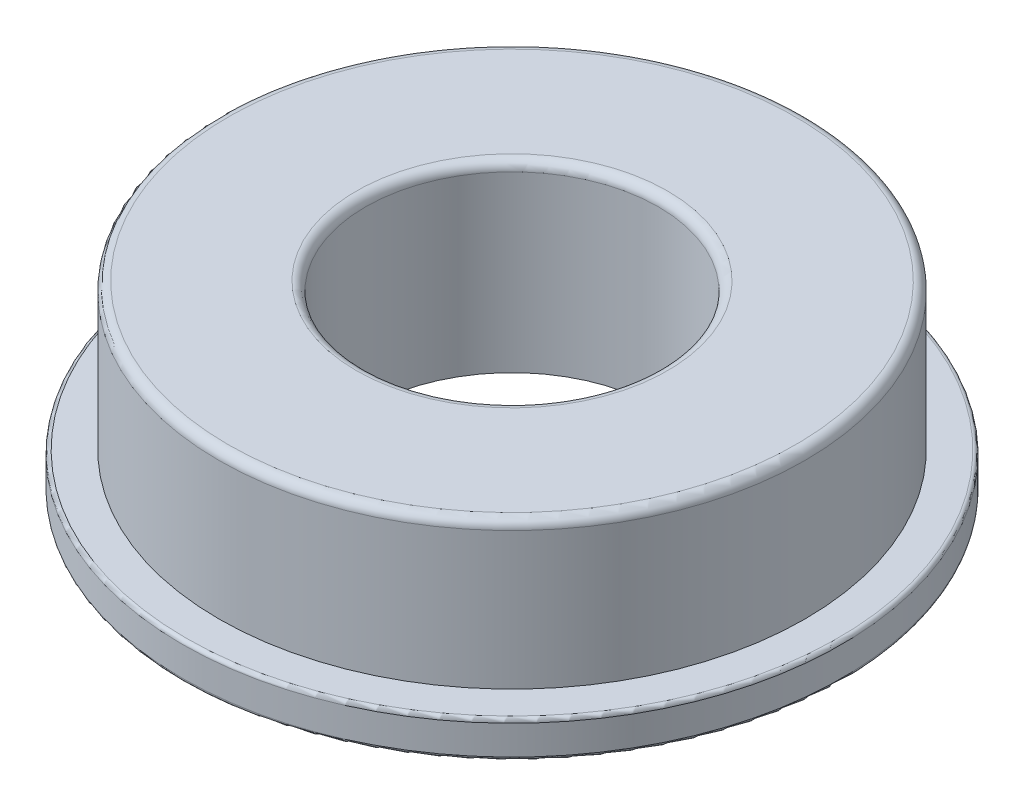
ISO-10303-21;
HEADER;
FILE_DESCRIPTION(('STEP AP214'),'2;1');
FILE_NAME('part.step','',(''),(''),'','','');
FILE_SCHEMA(('AUTOMOTIVE_DESIGN { 1 0 10303 214 1 1 1 1 }'));
ENDSEC;
DATA;
#1=APPLICATION_CONTEXT('core data for automotive mechanical design processes');
#2=APPLICATION_PROTOCOL_DEFINITION('international standard','automotive_design',2000,#1);
#3=PRODUCT_CONTEXT('',#1,'mechanical');
#4=PRODUCT('Part','Part','',(#3));
#5=PRODUCT_RELATED_PRODUCT_CATEGORY('part','',(#4));
#6=PRODUCT_DEFINITION_FORMATION('','',#4);
#7=PRODUCT_DEFINITION_CONTEXT('part definition',#1,'design');
#8=PRODUCT_DEFINITION('design','',#6,#7);
#9=PRODUCT_DEFINITION_SHAPE('','',#8);
#10=(LENGTH_UNIT() NAMED_UNIT(*) SI_UNIT(.MILLI.,.METRE.));
#11=(NAMED_UNIT(*) PLANE_ANGLE_UNIT() SI_UNIT($,.RADIAN.));
#12=(NAMED_UNIT(*) SI_UNIT($,.STERADIAN.) SOLID_ANGLE_UNIT());
#13=UNCERTAINTY_MEASURE_WITH_UNIT(LENGTH_MEASURE(1.E-05),#10,'distance_accuracy_value','');
#14=(GEOMETRIC_REPRESENTATION_CONTEXT(3) GLOBAL_UNCERTAINTY_ASSIGNED_CONTEXT((#13)) GLOBAL_UNIT_ASSIGNED_CONTEXT((#10,
#11,#12)) REPRESENTATION_CONTEXT('',''));
#15=CARTESIAN_POINT('',(0.,0.,0.));
#16=DIRECTION('',(0.,0.,1.));
#17=DIRECTION('',(1.,0.,0.));
#18=AXIS2_PLACEMENT_3D('',#15,#16,#17);
#19=CARTESIAN_POINT('',(0.,5.,0.));
#20=DIRECTION('',(0.,-1.,0.));
#21=DIRECTION('',(0.,0.,-1.));
#22=AXIS2_PLACEMENT_3D('',#19,#20,#21);
#23=CYLINDRICAL_SURFACE('',#22,8.);
#24=CARTESIAN_POINT('',(0.,4.75,0.));
#25=DIRECTION('',(0.,1.,0.));
#26=DIRECTION('',(0.,0.,1.));
#27=AXIS2_PLACEMENT_3D('',#24,#25,#26);
#28=CIRCLE('',#27,8.);
#29=CARTESIAN_POINT('',(0.,4.75,8.));
#30=VERTEX_POINT('',#29);
#31=EDGE_CURVE('E52',#30,#30,#28,.F.);
#32=ORIENTED_EDGE('',*,*,#31,.T.);
#33=EDGE_LOOP('',(#32));
#34=FACE_BOUND('',#33,.T.);
#35=CARTESIAN_POINT('',(0.,1.,0.));
#36=DIRECTION('',(0.,1.,0.));
#37=DIRECTION('',(0.,0.,1.));
#38=AXIS2_PLACEMENT_3D('',#35,#36,#37);
#39=CIRCLE('',#38,8.);
#40=CARTESIAN_POINT('',(0.,1.,8.));
#41=VERTEX_POINT('',#40);
#42=EDGE_CURVE('E64',#41,#41,#39,.T.);
#43=ORIENTED_EDGE('',*,*,#42,.T.);
#44=EDGE_LOOP('',(#43));
#45=FACE_BOUND('',#44,.T.);
#46=ADVANCED_FACE('F32',(#34,#45),#23,.T.);
#47=CARTESIAN_POINT('',(0.,5.,0.));
#48=DIRECTION('',(0.,1.,0.));
#49=DIRECTION('',(0.,0.,1.));
#50=AXIS2_PLACEMENT_3D('',#47,#48,#49);
#51=PLANE('',#50);
#52=CARTESIAN_POINT('',(0.,5.,0.));
#53=DIRECTION('',(0.,1.,0.));
#54=DIRECTION('',(0.,0.,1.));
#55=AXIS2_PLACEMENT_3D('',#52,#53,#54);
#56=CIRCLE('',#55,4.25);
#57=CARTESIAN_POINT('',(0.,5.,4.25));
#58=VERTEX_POINT('',#57);
#59=EDGE_CURVE('E55',#58,#58,#56,.F.);
#60=ORIENTED_EDGE('',*,*,#59,.T.);
#61=EDGE_LOOP('',(#60));
#62=FACE_BOUND('',#61,.T.);
#63=CARTESIAN_POINT('',(0.,5.,0.));
#64=DIRECTION('',(0.,1.,0.));
#65=DIRECTION('',(0.,0.,1.));
#66=AXIS2_PLACEMENT_3D('',#63,#64,#65);
#67=CIRCLE('',#66,7.75);
#68=CARTESIAN_POINT('',(0.,5.,7.75));
#69=VERTEX_POINT('',#68);
#70=EDGE_CURVE('E58',#69,#69,#67,.T.);
#71=ORIENTED_EDGE('',*,*,#70,.T.);
#72=EDGE_LOOP('',(#71));
#73=FACE_BOUND('',#72,.T.);
#74=ADVANCED_FACE('F89',(#62,#73),#51,.T.);
#75=CARTESIAN_POINT('',(0.,1.,0.));
#76=DIRECTION('',(0.,-1.,0.));
#77=DIRECTION('',(0.,0.,-1.));
#78=AXIS2_PLACEMENT_3D('',#75,#76,#77);
#79=CYLINDRICAL_SURFACE('',#78,9.);
#80=CARTESIAN_POINT('',(0.,0.9,0.));
#81=DIRECTION('',(0.,1.,0.));
#82=DIRECTION('',(0.,0.,1.));
#83=AXIS2_PLACEMENT_3D('',#80,#81,#82);
#84=CIRCLE('',#83,9.);
#85=CARTESIAN_POINT('',(0.,0.9,9.));
#86=VERTEX_POINT('',#85);
#87=EDGE_CURVE('E39',#86,#86,#84,.F.);
#88=ORIENTED_EDGE('',*,*,#87,.T.);
#89=EDGE_LOOP('',(#88));
#90=FACE_BOUND('',#89,.T.);
#91=CARTESIAN_POINT('',(0.,0.1,0.));
#92=DIRECTION('',(0.,1.,0.));
#93=DIRECTION('',(0.,0.,1.));
#94=AXIS2_PLACEMENT_3D('',#91,#92,#93);
#95=CIRCLE('',#94,9.);
#96=CARTESIAN_POINT('',(0.,0.1,9.));
#97=VERTEX_POINT('',#96);
#98=EDGE_CURVE('E43',#97,#97,#95,.T.);
#99=ORIENTED_EDGE('',*,*,#98,.T.);
#100=EDGE_LOOP('',(#99));
#101=FACE_BOUND('',#100,.T.);
#102=ADVANCED_FACE('F95',(#90,#101),#79,.T.);
#103=CARTESIAN_POINT('',(0.,1.,0.));
#104=DIRECTION('',(0.,1.,0.));
#105=DIRECTION('',(0.,0.,1.));
#106=AXIS2_PLACEMENT_3D('',#103,#104,#105);
#107=PLANE('',#106);
#108=CARTESIAN_POINT('',(0.,1.,0.));
#109=DIRECTION('',(0.,1.,0.));
#110=DIRECTION('',(0.,0.,1.));
#111=AXIS2_PLACEMENT_3D('',#108,#109,#110);
#112=CIRCLE('',#111,8.9);
#113=CARTESIAN_POINT('',(0.,1.,8.9));
#114=VERTEX_POINT('',#113);
#115=EDGE_CURVE('E47',#114,#114,#112,.T.);
#116=ORIENTED_EDGE('',*,*,#115,.T.);
#117=EDGE_LOOP('',(#116));
#118=FACE_BOUND('',#117,.T.);
#119=ORIENTED_EDGE('',*,*,#42,.F.);
#120=EDGE_LOOP('',(#119));
#121=FACE_BOUND('',#120,.T.);
#122=ADVANCED_FACE('F85',(#118,#121),#107,.T.);
#123=CARTESIAN_POINT('',(0.,0.,0.));
#124=DIRECTION('',(0.,1.,0.));
#125=DIRECTION('',(0.,0.,1.));
#126=AXIS2_PLACEMENT_3D('',#123,#124,#125);
#127=PLANE('',#126);
#128=CARTESIAN_POINT('',(0.,0.,0.));
#129=DIRECTION('',(0.,1.,0.));
#130=DIRECTION('',(0.,0.,1.));
#131=AXIS2_PLACEMENT_3D('',#128,#129,#130);
#132=CIRCLE('',#131,8.9);
#133=CARTESIAN_POINT('',(0.,0.,8.9));
#134=VERTEX_POINT('',#133);
#135=EDGE_CURVE('E10',#134,#134,#132,.F.);
#136=ORIENTED_EDGE('',*,*,#135,.T.);
#137=EDGE_LOOP('',(#136));
#138=FACE_BOUND('',#137,.T.);
#139=CARTESIAN_POINT('',(0.,0.,0.));
#140=DIRECTION('',(0.,1.,0.));
#141=DIRECTION('',(0.,0.,1.));
#142=AXIS2_PLACEMENT_3D('',#139,#140,#141);
#143=CIRCLE('',#142,4.);
#144=CARTESIAN_POINT('',(0.,0.,4.));
#145=VERTEX_POINT('',#144);
#146=EDGE_CURVE('E67',#145,#145,#143,.T.);
#147=ORIENTED_EDGE('',*,*,#146,.T.);
#148=EDGE_LOOP('',(#147));
#149=FACE_BOUND('',#148,.T.);
#150=ADVANCED_FACE('F71',(#138,#149),#127,.F.);
#151=CARTESIAN_POINT('',(0.,5.,0.));
#152=DIRECTION('',(0.,-1.,0.));
#153=DIRECTION('',(0.,0.,-1.));
#154=AXIS2_PLACEMENT_3D('',#151,#152,#153);
#155=CYLINDRICAL_SURFACE('',#154,4.);
#156=CARTESIAN_POINT('',(0.,4.75,0.));
#157=DIRECTION('',(0.,1.,0.));
#158=DIRECTION('',(0.,0.,1.));
#159=AXIS2_PLACEMENT_3D('',#156,#157,#158);
#160=CIRCLE('',#159,4.);
#161=CARTESIAN_POINT('',(0.,4.75,4.));
#162=VERTEX_POINT('',#161);
#163=EDGE_CURVE('E61',#162,#162,#160,.T.);
#164=ORIENTED_EDGE('',*,*,#163,.T.);
#165=EDGE_LOOP('',(#164));
#166=FACE_BOUND('',#165,.T.);
#167=ORIENTED_EDGE('',*,*,#146,.F.);
#168=EDGE_LOOP('',(#167));
#169=FACE_BOUND('',#168,.T.);
#170=ADVANCED_FACE('F73',(#166,#169),#155,.F.);
#171=CARTESIAN_POINT('',(0.,4.75,0.));
#172=DIRECTION('',(0.,1.,0.));
#173=DIRECTION('',(0.,0.,1.));
#174=AXIS2_PLACEMENT_3D('',#171,#172,#173);
#175=TOROIDAL_SURFACE('',#174,4.25,0.25);
#176=ORIENTED_EDGE('',*,*,#59,.F.);
#177=EDGE_LOOP('',(#176));
#178=FACE_BOUND('',#177,.T.);
#179=ORIENTED_EDGE('',*,*,#163,.F.);
#180=EDGE_LOOP('',(#179));
#181=FACE_BOUND('',#180,.T.);
#182=ADVANCED_FACE('F75',(#178,#181),#175,.T.);
#183=CARTESIAN_POINT('',(0.,4.75,0.));
#184=DIRECTION('',(0.,1.,0.));
#185=DIRECTION('',(0.,0.,1.));
#186=AXIS2_PLACEMENT_3D('',#183,#184,#185);
#187=TOROIDAL_SURFACE('',#186,7.75,0.25);
#188=ORIENTED_EDGE('',*,*,#31,.F.);
#189=EDGE_LOOP('',(#188));
#190=FACE_BOUND('',#189,.T.);
#191=ORIENTED_EDGE('',*,*,#70,.F.);
#192=EDGE_LOOP('',(#191));
#193=FACE_BOUND('',#192,.T.);
#194=ADVANCED_FACE('F82',(#190,#193),#187,.T.);
#195=CARTESIAN_POINT('',(0.,0.9,0.));
#196=DIRECTION('',(0.,1.,0.));
#197=DIRECTION('',(0.,0.,1.));
#198=AXIS2_PLACEMENT_3D('',#195,#196,#197);
#199=TOROIDAL_SURFACE('',#198,8.9,0.1);
#200=ORIENTED_EDGE('',*,*,#87,.F.);
#201=EDGE_LOOP('',(#200));
#202=FACE_BOUND('',#201,.T.);
#203=ORIENTED_EDGE('',*,*,#115,.F.);
#204=EDGE_LOOP('',(#203));
#205=FACE_BOUND('',#204,.T.);
#206=ADVANCED_FACE('F101',(#202,#205),#199,.T.);
#207=CARTESIAN_POINT('',(0.,0.1,0.));
#208=DIRECTION('',(0.,1.,0.));
#209=DIRECTION('',(0.,0.,1.));
#210=AXIS2_PLACEMENT_3D('',#207,#208,#209);
#211=TOROIDAL_SURFACE('',#210,8.9,0.1);
#212=ORIENTED_EDGE('',*,*,#135,.F.);
#213=EDGE_LOOP('',(#212));
#214=FACE_BOUND('',#213,.T.);
#215=ORIENTED_EDGE('',*,*,#98,.F.);
#216=EDGE_LOOP('',(#215));
#217=FACE_BOUND('',#216,.T.);
#218=ADVANCED_FACE('F34',(#214,#217),#211,.T.);
#219=CLOSED_SHELL('',(#46,#74,#102,#122,#150,#170,#182,#194,#206,#218));
#220=MANIFOLD_SOLID_BREP('B2',#219);
#221=ADVANCED_BREP_SHAPE_REPRESENTATION('',(#18,#220),#14);
#222=SHAPE_DEFINITION_REPRESENTATION(#9,#221);
ENDSEC;
END-ISO-10303-21;
